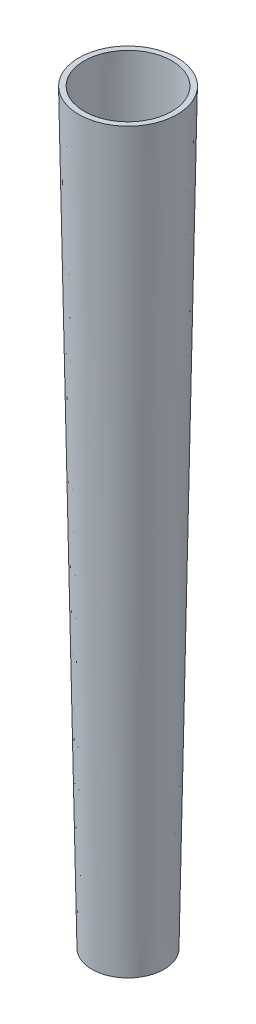
ISO-10303-21;
HEADER;
FILE_DESCRIPTION(('STEP AP214'),'2;1');
FILE_NAME('part.step','',(''),(''),'','','');
FILE_SCHEMA(('AUTOMOTIVE_DESIGN { 1 0 10303 214 1 1 1 1 }'));
ENDSEC;
DATA;
#1=APPLICATION_CONTEXT('core data for automotive mechanical design processes');
#2=APPLICATION_PROTOCOL_DEFINITION('international standard','automotive_design',2000,#1);
#3=PRODUCT_CONTEXT('',#1,'mechanical');
#4=PRODUCT('Part','Part','',(#3));
#5=PRODUCT_RELATED_PRODUCT_CATEGORY('part','',(#4));
#6=PRODUCT_DEFINITION_FORMATION('','',#4);
#7=PRODUCT_DEFINITION_CONTEXT('part definition',#1,'design');
#8=PRODUCT_DEFINITION('design','',#6,#7);
#9=PRODUCT_DEFINITION_SHAPE('','',#8);
#10=(LENGTH_UNIT() NAMED_UNIT(*) SI_UNIT(.MILLI.,.METRE.));
#11=(NAMED_UNIT(*) PLANE_ANGLE_UNIT() SI_UNIT($,.RADIAN.));
#12=(NAMED_UNIT(*) SI_UNIT($,.STERADIAN.) SOLID_ANGLE_UNIT());
#13=UNCERTAINTY_MEASURE_WITH_UNIT(LENGTH_MEASURE(1.E-05),#10,'distance_accuracy_value','');
#14=(GEOMETRIC_REPRESENTATION_CONTEXT(3) GLOBAL_UNCERTAINTY_ASSIGNED_CONTEXT((#13)) GLOBAL_UNIT_ASSIGNED_CONTEXT((#10,
#11,#12)) REPRESENTATION_CONTEXT('',''));
#15=CARTESIAN_POINT('',(0.,0.,0.));
#16=DIRECTION('',(0.,0.,1.));
#17=DIRECTION('',(1.,0.,0.));
#18=AXIS2_PLACEMENT_3D('',#15,#16,#17);
#19=CARTESIAN_POINT('',(-6.76948968208781,0.,0.));
#20=DIRECTION('',(0.,1.,0.));
#21=DIRECTION('',(0.,0.,1.));
#22=AXIS2_PLACEMENT_3D('',#19,#20,#21);
#23=PLANE('',#22);
#24=CARTESIAN_POINT('',(0.,0.,0.));
#25=DIRECTION('',(0.,-1.,0.));
#26=DIRECTION('',(0.,0.,-1.));
#27=AXIS2_PLACEMENT_3D('',#24,#25,#26);
#28=CIRCLE('',#27,5.76933735404391);
#29=CARTESIAN_POINT('',(0.,0.,-5.76933735404391));
#30=VERTEX_POINT('',#29);
#31=EDGE_CURVE('E10',#30,#30,#28,.T.);
#32=ORIENTED_EDGE('',*,*,#31,.F.);
#33=EDGE_LOOP('',(#32));
#34=FACE_BOUND('',#33,.T.);
#35=CARTESIAN_POINT('',(0.,0.,0.));
#36=DIRECTION('',(0.,-1.,0.));
#37=DIRECTION('',(0.,0.,-1.));
#38=AXIS2_PLACEMENT_3D('',#35,#36,#37);
#39=CIRCLE('',#38,6.76948968208781);
#40=CARTESIAN_POINT('',(0.,0.,-6.76948968208781));
#41=VERTEX_POINT('',#40);
#42=EDGE_CURVE('E54',#41,#41,#39,.T.);
#43=ORIENTED_EDGE('',*,*,#42,.T.);
#44=EDGE_LOOP('',(#43));
#45=FACE_BOUND('',#44,.T.);
#46=ADVANCED_FACE('F41',(#34,#45),#23,.F.);
#47=CARTESIAN_POINT('',(0.,0.,0.));
#48=DIRECTION('',(0.,1.,0.));
#49=DIRECTION('',(0.,0.,1.));
#50=AXIS2_PLACEMENT_3D('',#47,#48,#49);
#51=CONICAL_SURFACE('',#50,5.76933735404391,0.0174532925199534);
#52=CARTESIAN_POINT('',(0.,140.,0.));
#53=DIRECTION('',(0.,-1.,0.));
#54=DIRECTION('',(0.,0.,-1.));
#55=AXIS2_PLACEMENT_3D('',#52,#53,#54);
#56=CIRCLE('',#55,8.21304644399579);
#57=CARTESIAN_POINT('',(0.,140.,-8.21304644399579));
#58=VERTEX_POINT('',#57);
#59=EDGE_CURVE('E50',#58,#58,#56,.T.);
#60=ORIENTED_EDGE('',*,*,#59,.F.);
#61=EDGE_LOOP('',(#60));
#62=FACE_BOUND('',#61,.T.);
#63=ORIENTED_EDGE('',*,*,#31,.T.);
#64=EDGE_LOOP('',(#63));
#65=FACE_BOUND('',#64,.T.);
#66=ADVANCED_FACE('F67',(#62,#65),#51,.F.);
#67=CARTESIAN_POINT('',(-9.2131987720397,140.,0.));
#68=DIRECTION('',(0.,-1.,0.));
#69=DIRECTION('',(0.,0.,-1.));
#70=AXIS2_PLACEMENT_3D('',#67,#68,#69);
#71=PLANE('',#70);
#72=CARTESIAN_POINT('',(0.,140.,0.));
#73=DIRECTION('',(0.,-1.,0.));
#74=DIRECTION('',(0.,0.,-1.));
#75=AXIS2_PLACEMENT_3D('',#72,#73,#74);
#76=CIRCLE('',#75,9.2131987720397);
#77=CARTESIAN_POINT('',(0.,140.,-9.2131987720397));
#78=VERTEX_POINT('',#77);
#79=EDGE_CURVE('E51',#78,#78,#76,.T.);
#80=ORIENTED_EDGE('',*,*,#79,.F.);
#81=EDGE_LOOP('',(#80));
#82=FACE_BOUND('',#81,.T.);
#83=ORIENTED_EDGE('',*,*,#59,.T.);
#84=EDGE_LOOP('',(#83));
#85=FACE_BOUND('',#84,.T.);
#86=ADVANCED_FACE('F62',(#82,#85),#71,.F.);
#87=CARTESIAN_POINT('',(0.,140.,0.));
#88=DIRECTION('',(0.,1.,0.));
#89=DIRECTION('',(0.,0.,1.));
#90=AXIS2_PLACEMENT_3D('',#87,#88,#89);
#91=CONICAL_SURFACE('',#90,9.2131987720397,0.0174532925199535);
#92=ORIENTED_EDGE('',*,*,#42,.F.);
#93=EDGE_LOOP('',(#92));
#94=FACE_BOUND('',#93,.T.);
#95=ORIENTED_EDGE('',*,*,#79,.T.);
#96=EDGE_LOOP('',(#95));
#97=FACE_BOUND('',#96,.T.);
#98=ADVANCED_FACE('F61',(#94,#97),#91,.T.);
#99=CLOSED_SHELL('',(#46,#66,#86,#98));
#100=MANIFOLD_SOLID_BREP('B2',#99);
#101=ADVANCED_BREP_SHAPE_REPRESENTATION('',(#18,#100),#14);
#102=SHAPE_DEFINITION_REPRESENTATION(#9,#101);
ENDSEC;
END-ISO-10303-21;
